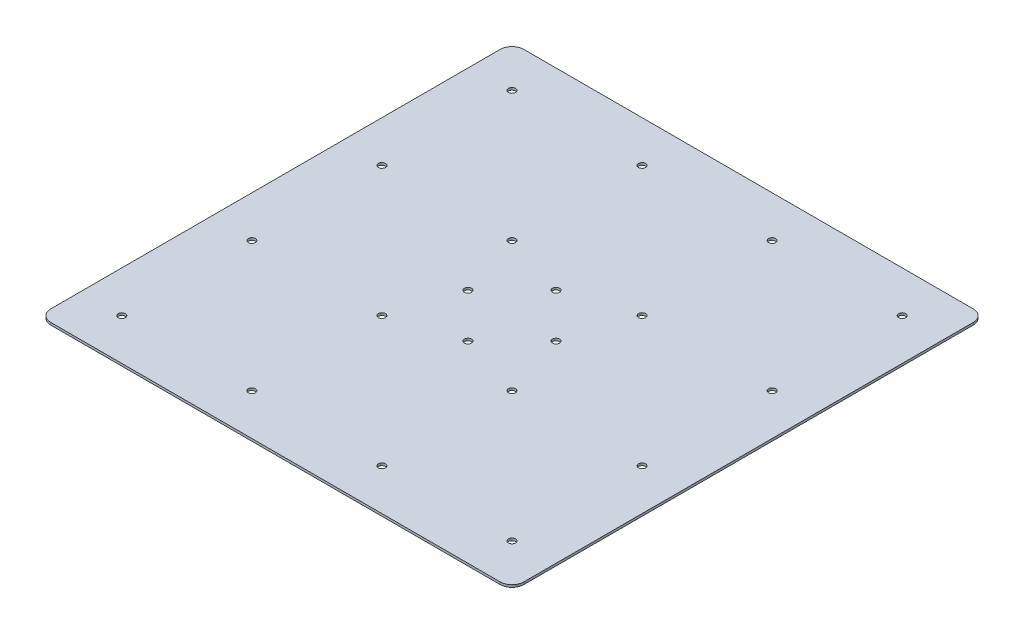
ISO-10303-21;
HEADER;
FILE_DESCRIPTION(('STEP AP214'),'2;1');
FILE_NAME('part.step','',(''),(''),'','','');
FILE_SCHEMA(('AUTOMOTIVE_DESIGN { 1 0 10303 214 1 1 1 1 }'));
ENDSEC;
DATA;
#1=APPLICATION_CONTEXT('core data for automotive mechanical design processes');
#2=APPLICATION_PROTOCOL_DEFINITION('international standard','automotive_design',2000,#1);
#3=PRODUCT_CONTEXT('',#1,'mechanical');
#4=PRODUCT('Part','Part','',(#3));
#5=PRODUCT_RELATED_PRODUCT_CATEGORY('part','',(#4));
#6=PRODUCT_DEFINITION_FORMATION('','',#4);
#7=PRODUCT_DEFINITION_CONTEXT('part definition',#1,'design');
#8=PRODUCT_DEFINITION('design','',#6,#7);
#9=PRODUCT_DEFINITION_SHAPE('','',#8);
#10=(LENGTH_UNIT() NAMED_UNIT(*) SI_UNIT(.MILLI.,.METRE.));
#11=(NAMED_UNIT(*) PLANE_ANGLE_UNIT() SI_UNIT($,.RADIAN.));
#12=(NAMED_UNIT(*) SI_UNIT($,.STERADIAN.) SOLID_ANGLE_UNIT());
#13=UNCERTAINTY_MEASURE_WITH_UNIT(LENGTH_MEASURE(1.E-05),#10,'distance_accuracy_value','');
#14=(GEOMETRIC_REPRESENTATION_CONTEXT(3) GLOBAL_UNCERTAINTY_ASSIGNED_CONTEXT((#13)) GLOBAL_UNIT_ASSIGNED_CONTEXT((#10,
#11,#12)) REPRESENTATION_CONTEXT('',''));
#15=CARTESIAN_POINT('',(0.,0.,0.));
#16=DIRECTION('',(0.,0.,1.));
#17=DIRECTION('',(1.,0.,0.));
#18=AXIS2_PLACEMENT_3D('',#15,#16,#17);
#19=CARTESIAN_POINT('',(200.,2.,-200.));
#20=DIRECTION('',(-1.,0.,0.));
#21=DIRECTION('',(0.,0.,1.));
#22=AXIS2_PLACEMENT_3D('',#19,#20,#21);
#23=PLANE('',#22);
#24=DIRECTION('',(0.,0.,-1.));
#25=VECTOR('',#24,1.);
#26=CARTESIAN_POINT('',(200.,2.,-200.));
#27=LINE('',#26,#25);
#28=CARTESIAN_POINT('',(200.,2.,190.));
#29=VERTEX_POINT('',#28);
#30=CARTESIAN_POINT('',(200.,2.,-190.));
#31=VERTEX_POINT('',#30);
#32=EDGE_CURVE('E128',#29,#31,#27,.T.);
#33=ORIENTED_EDGE('',*,*,#32,.F.);
#34=DIRECTION('',(0.,-1.,0.));
#35=VECTOR('',#34,1.);
#36=CARTESIAN_POINT('',(200.,2.,190.));
#37=LINE('',#36,#35);
#38=CARTESIAN_POINT('',(200.,0.,190.));
#39=VERTEX_POINT('',#38);
#40=EDGE_CURVE('E154',#29,#39,#37,.T.);
#41=ORIENTED_EDGE('',*,*,#40,.T.);
#42=DIRECTION('',(0.,0.,-1.));
#43=VECTOR('',#42,1.);
#44=CARTESIAN_POINT('',(200.,0.,-200.));
#45=LINE('',#44,#43);
#46=CARTESIAN_POINT('',(200.,0.,-190.));
#47=VERTEX_POINT('',#46);
#48=EDGE_CURVE('E160',#39,#47,#45,.T.);
#49=ORIENTED_EDGE('',*,*,#48,.T.);
#50=DIRECTION('',(0.,-1.,0.));
#51=VECTOR('',#50,1.);
#52=CARTESIAN_POINT('',(200.,2.,-190.));
#53=LINE('',#52,#51);
#54=EDGE_CURVE('E152',#47,#31,#53,.F.);
#55=ORIENTED_EDGE('',*,*,#54,.T.);
#56=EDGE_LOOP('',(#33,#41,#49,#55));
#57=FACE_BOUND('',#56,.T.);
#58=ADVANCED_FACE('F36',(#57),#23,.F.);
#59=CARTESIAN_POINT('',(-200.,2.,-200.));
#60=DIRECTION('',(0.,0.,1.));
#61=DIRECTION('',(1.,0.,0.));
#62=AXIS2_PLACEMENT_3D('',#59,#60,#61);
#63=PLANE('',#62);
#64=DIRECTION('',(-1.,0.,0.));
#65=VECTOR('',#64,1.);
#66=CARTESIAN_POINT('',(-200.,2.,-200.));
#67=LINE('',#66,#65);
#68=CARTESIAN_POINT('',(190.,2.,-200.));
#69=VERTEX_POINT('',#68);
#70=CARTESIAN_POINT('',(-190.,2.,-200.));
#71=VERTEX_POINT('',#70);
#72=EDGE_CURVE('E131',#69,#71,#67,.T.);
#73=ORIENTED_EDGE('',*,*,#72,.F.);
#74=DIRECTION('',(0.,-1.,0.));
#75=VECTOR('',#74,1.);
#76=CARTESIAN_POINT('',(190.,2.,-200.));
#77=LINE('',#76,#75);
#78=CARTESIAN_POINT('',(190.,0.,-200.));
#79=VERTEX_POINT('',#78);
#80=EDGE_CURVE('E11',#69,#79,#77,.T.);
#81=ORIENTED_EDGE('',*,*,#80,.T.);
#82=DIRECTION('',(-1.,0.,0.));
#83=VECTOR('',#82,1.);
#84=CARTESIAN_POINT('',(-200.,0.,-200.));
#85=LINE('',#84,#83);
#86=CARTESIAN_POINT('',(-190.,0.,-200.));
#87=VERTEX_POINT('',#86);
#88=EDGE_CURVE('E133',#79,#87,#85,.T.);
#89=ORIENTED_EDGE('',*,*,#88,.T.);
#90=DIRECTION('',(0.,-1.,0.));
#91=VECTOR('',#90,1.);
#92=CARTESIAN_POINT('',(-190.,2.,-200.));
#93=LINE('',#92,#91);
#94=EDGE_CURVE('E44',#87,#71,#93,.F.);
#95=ORIENTED_EDGE('',*,*,#94,.T.);
#96=EDGE_LOOP('',(#73,#81,#89,#95));
#97=FACE_BOUND('',#96,.T.);
#98=ADVANCED_FACE('F333',(#97),#63,.F.);
#99=CARTESIAN_POINT('',(-200.,2.,-200.));
#100=DIRECTION('',(1.,0.,0.));
#101=DIRECTION('',(0.,0.,-1.));
#102=AXIS2_PLACEMENT_3D('',#99,#100,#101);
#103=PLANE('',#102);
#104=DIRECTION('',(0.,0.,1.));
#105=VECTOR('',#104,1.);
#106=CARTESIAN_POINT('',(-200.,0.,-200.));
#107=LINE('',#106,#105);
#108=CARTESIAN_POINT('',(-200.,0.,-190.));
#109=VERTEX_POINT('',#108);
#110=CARTESIAN_POINT('',(-200.,0.,190.));
#111=VERTEX_POINT('',#110);
#112=EDGE_CURVE('E129',#109,#111,#107,.T.);
#113=ORIENTED_EDGE('',*,*,#112,.T.);
#114=DIRECTION('',(0.,-1.,0.));
#115=VECTOR('',#114,1.);
#116=CARTESIAN_POINT('',(-200.,2.,190.));
#117=LINE('',#116,#115);
#118=CARTESIAN_POINT('',(-200.,2.,190.));
#119=VERTEX_POINT('',#118);
#120=EDGE_CURVE('E107',#111,#119,#117,.F.);
#121=ORIENTED_EDGE('',*,*,#120,.T.);
#122=DIRECTION('',(0.,0.,1.));
#123=VECTOR('',#122,1.);
#124=CARTESIAN_POINT('',(-200.,2.,-200.));
#125=LINE('',#124,#123);
#126=CARTESIAN_POINT('',(-200.,2.,-190.));
#127=VERTEX_POINT('',#126);
#128=EDGE_CURVE('E172',#127,#119,#125,.T.);
#129=ORIENTED_EDGE('',*,*,#128,.F.);
#130=DIRECTION('',(0.,-1.,0.));
#131=VECTOR('',#130,1.);
#132=CARTESIAN_POINT('',(-200.,2.,-190.));
#133=LINE('',#132,#131);
#134=EDGE_CURVE('E112',#127,#109,#133,.T.);
#135=ORIENTED_EDGE('',*,*,#134,.T.);
#136=EDGE_LOOP('',(#113,#121,#129,#135));
#137=FACE_BOUND('',#136,.T.);
#138=ADVANCED_FACE('F331',(#137),#103,.F.);
#139=CARTESIAN_POINT('',(-200.,2.,200.));
#140=DIRECTION('',(0.,0.,-1.));
#141=DIRECTION('',(-1.,0.,0.));
#142=AXIS2_PLACEMENT_3D('',#139,#140,#141);
#143=PLANE('',#142);
#144=DIRECTION('',(1.,0.,0.));
#145=VECTOR('',#144,1.);
#146=CARTESIAN_POINT('',(-200.,2.,200.));
#147=LINE('',#146,#145);
#148=CARTESIAN_POINT('',(-190.,2.,200.));
#149=VERTEX_POINT('',#148);
#150=CARTESIAN_POINT('',(190.,2.,200.));
#151=VERTEX_POINT('',#150);
#152=EDGE_CURVE('E122',#149,#151,#147,.T.);
#153=ORIENTED_EDGE('',*,*,#152,.F.);
#154=DIRECTION('',(0.,-1.,0.));
#155=VECTOR('',#154,1.);
#156=CARTESIAN_POINT('',(-190.,2.,200.));
#157=LINE('',#156,#155);
#158=CARTESIAN_POINT('',(-190.,0.,200.));
#159=VERTEX_POINT('',#158);
#160=EDGE_CURVE('E106',#149,#159,#157,.T.);
#161=ORIENTED_EDGE('',*,*,#160,.T.);
#162=DIRECTION('',(1.,0.,0.));
#163=VECTOR('',#162,1.);
#164=CARTESIAN_POINT('',(-200.,0.,200.));
#165=LINE('',#164,#163);
#166=CARTESIAN_POINT('',(190.,0.,200.));
#167=VERTEX_POINT('',#166);
#168=EDGE_CURVE('E119',#159,#167,#165,.T.);
#169=ORIENTED_EDGE('',*,*,#168,.T.);
#170=DIRECTION('',(0.,-1.,0.));
#171=VECTOR('',#170,1.);
#172=CARTESIAN_POINT('',(190.,2.,200.));
#173=LINE('',#172,#171);
#174=EDGE_CURVE('E124',#167,#151,#173,.F.);
#175=ORIENTED_EDGE('',*,*,#174,.T.);
#176=EDGE_LOOP('',(#153,#161,#169,#175));
#177=FACE_BOUND('',#176,.T.);
#178=ADVANCED_FACE('F118',(#177),#143,.F.);
#179=CARTESIAN_POINT('',(0.,2.,0.));
#180=DIRECTION('',(0.,1.,0.));
#181=DIRECTION('',(0.,0.,1.));
#182=AXIS2_PLACEMENT_3D('',#179,#180,#181);
#183=PLANE('',#182);
#184=CARTESIAN_POINT('',(55.0000000000022,2.,55.));
#185=DIRECTION('',(0.,1.,0.));
#186=DIRECTION('',(0.,0.,1.));
#187=AXIS2_PLACEMENT_3D('',#184,#185,#186);
#188=CIRCLE('',#187,2.99999999999999);
#189=CARTESIAN_POINT('',(55.0000000000022,2.,58.));
#190=VERTEX_POINT('',#189);
#191=EDGE_CURVE('E227',#190,#190,#188,.T.);
#192=ORIENTED_EDGE('',*,*,#191,.F.);
#193=EDGE_LOOP('',(#192));
#194=FACE_BOUND('',#193,.T.);
#195=CARTESIAN_POINT('',(-54.9999999999978,2.,55.));
#196=DIRECTION('',(0.,1.,0.));
#197=DIRECTION('',(0.,0.,1.));
#198=AXIS2_PLACEMENT_3D('',#195,#196,#197);
#199=CIRCLE('',#198,2.99999999999999);
#200=CARTESIAN_POINT('',(-54.9999999999978,2.,58.));
#201=VERTEX_POINT('',#200);
#202=EDGE_CURVE('E234',#201,#201,#199,.T.);
#203=ORIENTED_EDGE('',*,*,#202,.F.);
#204=EDGE_LOOP('',(#203));
#205=FACE_BOUND('',#204,.T.);
#206=CARTESIAN_POINT('',(165.000000000001,2.,-55.));
#207=DIRECTION('',(0.,1.,0.));
#208=DIRECTION('',(0.,0.,1.));
#209=AXIS2_PLACEMENT_3D('',#206,#207,#208);
#210=CIRCLE('',#209,2.99999999999999);
#211=CARTESIAN_POINT('',(165.000000000001,2.,-52.));
#212=VERTEX_POINT('',#211);
#213=EDGE_CURVE('E240',#212,#212,#210,.T.);
#214=ORIENTED_EDGE('',*,*,#213,.F.);
#215=EDGE_LOOP('',(#214));
#216=FACE_BOUND('',#215,.T.);
#217=CARTESIAN_POINT('',(55.0000000000011,2.,-55.));
#218=DIRECTION('',(0.,1.,0.));
#219=DIRECTION('',(0.,0.,1.));
#220=AXIS2_PLACEMENT_3D('',#217,#218,#219);
#221=CIRCLE('',#220,2.99999999999999);
#222=CARTESIAN_POINT('',(55.0000000000011,2.,-52.));
#223=VERTEX_POINT('',#222);
#224=EDGE_CURVE('E246',#223,#223,#221,.T.);
#225=ORIENTED_EDGE('',*,*,#224,.F.);
#226=EDGE_LOOP('',(#225));
#227=FACE_BOUND('',#226,.T.);
#228=CARTESIAN_POINT('',(-55.0000000000001,2.,-165.));
#229=DIRECTION('',(0.,1.,0.));
#230=DIRECTION('',(0.,0.,1.));
#231=AXIS2_PLACEMENT_3D('',#228,#229,#230);
#232=CIRCLE('',#231,2.99999999999999);
#233=CARTESIAN_POINT('',(-55.0000000000001,2.,-162.));
#234=VERTEX_POINT('',#233);
#235=EDGE_CURVE('E210',#234,#234,#232,.T.);
#236=ORIENTED_EDGE('',*,*,#235,.F.);
#237=EDGE_LOOP('',(#236));
#238=FACE_BOUND('',#237,.T.);
#239=CARTESIAN_POINT('',(54.9999999999999,2.,-165.));
#240=DIRECTION('',(0.,1.,0.));
#241=DIRECTION('',(0.,0.,1.));
#242=AXIS2_PLACEMENT_3D('',#239,#240,#241);
#243=CIRCLE('',#242,2.99999999999999);
#244=CARTESIAN_POINT('',(54.9999999999999,2.,-162.));
#245=VERTEX_POINT('',#244);
#246=EDGE_CURVE('E203',#245,#245,#243,.T.);
#247=ORIENTED_EDGE('',*,*,#246,.F.);
#248=EDGE_LOOP('',(#247));
#249=FACE_BOUND('',#248,.T.);
#250=CARTESIAN_POINT('',(165.,2.,-165.));
#251=DIRECTION('',(0.,1.,0.));
#252=DIRECTION('',(0.,0.,1.));
#253=AXIS2_PLACEMENT_3D('',#250,#251,#252);
#254=CIRCLE('',#253,2.99999999999999);
#255=CARTESIAN_POINT('',(165.,2.,-162.));
#256=VERTEX_POINT('',#255);
#257=EDGE_CURVE('E222',#256,#256,#254,.T.);
#258=ORIENTED_EDGE('',*,*,#257,.F.);
#259=EDGE_LOOP('',(#258));
#260=FACE_BOUND('',#259,.T.);
#261=CARTESIAN_POINT('',(-54.999999999999,2.,-55.));
#262=DIRECTION('',(0.,1.,0.));
#263=DIRECTION('',(0.,0.,1.));
#264=AXIS2_PLACEMENT_3D('',#261,#262,#263);
#265=CIRCLE('',#264,2.99999999999999);
#266=CARTESIAN_POINT('',(-54.999999999999,2.,-52.));
#267=VERTEX_POINT('',#266);
#268=EDGE_CURVE('E215',#267,#267,#265,.T.);
#269=ORIENTED_EDGE('',*,*,#268,.F.);
#270=EDGE_LOOP('',(#269));
#271=FACE_BOUND('',#270,.T.);
#272=CARTESIAN_POINT('',(165.000000000003,2.,165.));
#273=DIRECTION('',(0.,1.,0.));
#274=DIRECTION('',(0.,0.,1.));
#275=AXIS2_PLACEMENT_3D('',#272,#273,#274);
#276=CIRCLE('',#275,2.99999999999999);
#277=CARTESIAN_POINT('',(165.000000000003,2.,168.));
#278=VERTEX_POINT('',#277);
#279=EDGE_CURVE('E269',#278,#278,#276,.T.);
#280=ORIENTED_EDGE('',*,*,#279,.F.);
#281=EDGE_LOOP('',(#280));
#282=FACE_BOUND('',#281,.T.);
#283=CARTESIAN_POINT('',(55.0000000000034,2.,165.));
#284=DIRECTION('',(0.,1.,0.));
#285=DIRECTION('',(0.,0.,1.));
#286=AXIS2_PLACEMENT_3D('',#283,#284,#285);
#287=CIRCLE('',#286,2.99999999999999);
#288=CARTESIAN_POINT('',(55.0000000000034,2.,168.));
#289=VERTEX_POINT('',#288);
#290=EDGE_CURVE('E287',#289,#289,#287,.T.);
#291=ORIENTED_EDGE('',*,*,#290,.F.);
#292=EDGE_LOOP('',(#291));
#293=FACE_BOUND('',#292,.T.);
#294=CARTESIAN_POINT('',(-54.9999999999967,2.,165.));
#295=DIRECTION('',(0.,1.,0.));
#296=DIRECTION('',(0.,0.,1.));
#297=AXIS2_PLACEMENT_3D('',#294,#295,#296);
#298=CIRCLE('',#297,2.99999999999999);
#299=CARTESIAN_POINT('',(-54.9999999999967,2.,168.));
#300=VERTEX_POINT('',#299);
#301=EDGE_CURVE('E270',#300,#300,#298,.T.);
#302=ORIENTED_EDGE('',*,*,#301,.F.);
#303=EDGE_LOOP('',(#302));
#304=FACE_BOUND('',#303,.T.);
#305=CARTESIAN_POINT('',(165.000000000002,2.,55.));
#306=DIRECTION('',(0.,1.,0.));
#307=DIRECTION('',(0.,0.,1.));
#308=AXIS2_PLACEMENT_3D('',#305,#306,#307);
#309=CIRCLE('',#308,2.99999999999999);
#310=CARTESIAN_POINT('',(165.000000000002,2.,58.));
#311=VERTEX_POINT('',#310);
#312=EDGE_CURVE('E277',#311,#311,#309,.T.);
#313=ORIENTED_EDGE('',*,*,#312,.F.);
#314=EDGE_LOOP('',(#313));
#315=FACE_BOUND('',#314,.T.);
#316=CARTESIAN_POINT('',(-164.999999999999,2.,-55.));
#317=DIRECTION('',(0.,1.,0.));
#318=DIRECTION('',(0.,0.,1.));
#319=AXIS2_PLACEMENT_3D('',#316,#317,#318);
#320=CIRCLE('',#319,2.99999999999999);
#321=CARTESIAN_POINT('',(-164.999999999999,2.,-52.));
#322=VERTEX_POINT('',#321);
#323=EDGE_CURVE('E263',#322,#322,#320,.T.);
#324=ORIENTED_EDGE('',*,*,#323,.F.);
#325=EDGE_LOOP('',(#324));
#326=FACE_BOUND('',#325,.T.);
#327=CARTESIAN_POINT('',(-164.999999999998,2.,55.));
#328=DIRECTION('',(0.,1.,0.));
#329=DIRECTION('',(0.,0.,1.));
#330=AXIS2_PLACEMENT_3D('',#327,#328,#329);
#331=CIRCLE('',#330,2.99999999999999);
#332=CARTESIAN_POINT('',(-164.999999999998,2.,58.));
#333=VERTEX_POINT('',#332);
#334=EDGE_CURVE('E257',#333,#333,#331,.T.);
#335=ORIENTED_EDGE('',*,*,#334,.F.);
#336=EDGE_LOOP('',(#335));
#337=FACE_BOUND('',#336,.T.);
#338=CARTESIAN_POINT('',(-164.999999999997,2.,165.));
#339=DIRECTION('',(0.,1.,0.));
#340=DIRECTION('',(0.,0.,1.));
#341=AXIS2_PLACEMENT_3D('',#338,#339,#340);
#342=CIRCLE('',#341,2.99999999999999);
#343=CARTESIAN_POINT('',(-164.999999999997,2.,168.));
#344=VERTEX_POINT('',#343);
#345=EDGE_CURVE('E251',#344,#344,#342,.T.);
#346=ORIENTED_EDGE('',*,*,#345,.F.);
#347=EDGE_LOOP('',(#346));
#348=FACE_BOUND('',#347,.T.);
#349=CARTESIAN_POINT('',(-165.,2.,-165.));
#350=DIRECTION('',(0.,1.,0.));
#351=DIRECTION('',(0.,0.,1.));
#352=AXIS2_PLACEMENT_3D('',#349,#350,#351);
#353=CIRCLE('',#352,2.99999999999999);
#354=CARTESIAN_POINT('',(-165.,2.,-162.));
#355=VERTEX_POINT('',#354);
#356=EDGE_CURVE('E197',#355,#355,#353,.T.);
#357=ORIENTED_EDGE('',*,*,#356,.F.);
#358=EDGE_LOOP('',(#357));
#359=FACE_BOUND('',#358,.T.);
#360=CARTESIAN_POINT('',(-3.87705226760231E-13,2.,37.25));
#361=DIRECTION('',(0.,1.,0.));
#362=DIRECTION('',(0.,0.,1.));
#363=AXIS2_PLACEMENT_3D('',#360,#361,#362);
#364=CIRCLE('',#363,3.);
#365=CARTESIAN_POINT('',(-3.87705226760231E-13,2.,40.25));
#366=VERTEX_POINT('',#365);
#367=EDGE_CURVE('E168',#366,#366,#364,.T.);
#368=ORIENTED_EDGE('',*,*,#367,.F.);
#369=EDGE_LOOP('',(#368));
#370=FACE_BOUND('',#369,.T.);
#371=CARTESIAN_POINT('',(-37.25,2.,0.));
#372=DIRECTION('',(0.,1.,0.));
#373=DIRECTION('',(0.,0.,1.));
#374=AXIS2_PLACEMENT_3D('',#371,#372,#373);
#375=CIRCLE('',#374,3.);
#376=CARTESIAN_POINT('',(-37.25,2.,3.));
#377=VERTEX_POINT('',#376);
#378=EDGE_CURVE('E192',#377,#377,#375,.T.);
#379=ORIENTED_EDGE('',*,*,#378,.F.);
#380=EDGE_LOOP('',(#379));
#381=FACE_BOUND('',#380,.T.);
#382=CARTESIAN_POINT('',(1.20650973112511E-13,2.,-37.25));
#383=DIRECTION('',(0.,1.,0.));
#384=DIRECTION('',(0.,0.,1.));
#385=AXIS2_PLACEMENT_3D('',#382,#383,#384);
#386=CIRCLE('',#385,3.);
#387=CARTESIAN_POINT('',(1.20650973112511E-13,2.,-34.25));
#388=VERTEX_POINT('',#387);
#389=EDGE_CURVE('E186',#388,#388,#386,.T.);
#390=ORIENTED_EDGE('',*,*,#389,.F.);
#391=EDGE_LOOP('',(#390));
#392=FACE_BOUND('',#391,.T.);
#393=CARTESIAN_POINT('',(37.25,2.,2.57647546888325E-13));
#394=DIRECTION('',(0.,1.,0.));
#395=DIRECTION('',(0.,0.,1.));
#396=AXIS2_PLACEMENT_3D('',#393,#394,#395);
#397=CIRCLE('',#396,3.);
#398=CARTESIAN_POINT('',(37.25,2.,3.00000000000026));
#399=VERTEX_POINT('',#398);
#400=EDGE_CURVE('E179',#399,#399,#397,.T.);
#401=ORIENTED_EDGE('',*,*,#400,.F.);
#402=EDGE_LOOP('',(#401));
#403=FACE_BOUND('',#402,.T.);
#404=ORIENTED_EDGE('',*,*,#128,.T.);
#405=CARTESIAN_POINT('',(-190.,2.,190.));
#406=DIRECTION('',(0.,1.,0.));
#407=DIRECTION('',(0.,0.,1.));
#408=AXIS2_PLACEMENT_3D('',#405,#406,#407);
#409=CIRCLE('',#408,10.);
#410=EDGE_CURVE('E150',#119,#149,#409,.T.);
#411=ORIENTED_EDGE('',*,*,#410,.T.);
#412=ORIENTED_EDGE('',*,*,#152,.T.);
#413=CARTESIAN_POINT('',(190.,2.,190.));
#414=DIRECTION('',(0.,1.,0.));
#415=DIRECTION('',(0.,0.,1.));
#416=AXIS2_PLACEMENT_3D('',#413,#414,#415);
#417=CIRCLE('',#416,10.);
#418=EDGE_CURVE('E148',#151,#29,#417,.T.);
#419=ORIENTED_EDGE('',*,*,#418,.T.);
#420=ORIENTED_EDGE('',*,*,#32,.T.);
#421=CARTESIAN_POINT('',(190.,2.,-190.));
#422=DIRECTION('',(0.,1.,0.));
#423=DIRECTION('',(0.,0.,1.));
#424=AXIS2_PLACEMENT_3D('',#421,#422,#423);
#425=CIRCLE('',#424,10.);
#426=EDGE_CURVE('E57',#31,#69,#425,.T.);
#427=ORIENTED_EDGE('',*,*,#426,.T.);
#428=ORIENTED_EDGE('',*,*,#72,.T.);
#429=CARTESIAN_POINT('',(-190.,2.,-190.));
#430=DIRECTION('',(0.,1.,0.));
#431=DIRECTION('',(0.,0.,1.));
#432=AXIS2_PLACEMENT_3D('',#429,#430,#431);
#433=CIRCLE('',#432,10.);
#434=EDGE_CURVE('E145',#71,#127,#433,.T.);
#435=ORIENTED_EDGE('',*,*,#434,.T.);
#436=EDGE_LOOP('',(#404,#411,#412,#419,#420,#427,#428,#435));
#437=FACE_BOUND('',#436,.T.);
#438=ADVANCED_FACE('F303',(#194,#205,#216,#227,#238,#249,#260,#271,#282,#293,#304,#315,#326,
#337,#348,#359,#370,#381,#392,#403,#437),#183,.T.);
#439=CARTESIAN_POINT('',(0.,0.,0.));
#440=DIRECTION('',(0.,1.,0.));
#441=DIRECTION('',(0.,0.,1.));
#442=AXIS2_PLACEMENT_3D('',#439,#440,#441);
#443=PLANE('',#442);
#444=CARTESIAN_POINT('',(55.0000000000022,0.,55.));
#445=DIRECTION('',(0.,1.,0.));
#446=DIRECTION('',(0.,0.,1.));
#447=AXIS2_PLACEMENT_3D('',#444,#445,#446);
#448=CIRCLE('',#447,2.99999999999999);
#449=CARTESIAN_POINT('',(55.0000000000022,0.,58.));
#450=VERTEX_POINT('',#449);
#451=EDGE_CURVE('E230',#450,#450,#448,.T.);
#452=ORIENTED_EDGE('',*,*,#451,.T.);
#453=EDGE_LOOP('',(#452));
#454=FACE_BOUND('',#453,.T.);
#455=CARTESIAN_POINT('',(-54.9999999999978,0.,55.));
#456=DIRECTION('',(0.,1.,0.));
#457=DIRECTION('',(0.,0.,1.));
#458=AXIS2_PLACEMENT_3D('',#455,#456,#457);
#459=CIRCLE('',#458,2.99999999999999);
#460=CARTESIAN_POINT('',(-54.9999999999978,0.,58.));
#461=VERTEX_POINT('',#460);
#462=EDGE_CURVE('E237',#461,#461,#459,.T.);
#463=ORIENTED_EDGE('',*,*,#462,.T.);
#464=EDGE_LOOP('',(#463));
#465=FACE_BOUND('',#464,.T.);
#466=CARTESIAN_POINT('',(165.000000000001,0.,-55.));
#467=DIRECTION('',(0.,1.,0.));
#468=DIRECTION('',(0.,0.,1.));
#469=AXIS2_PLACEMENT_3D('',#466,#467,#468);
#470=CIRCLE('',#469,2.99999999999999);
#471=CARTESIAN_POINT('',(165.000000000001,0.,-52.));
#472=VERTEX_POINT('',#471);
#473=EDGE_CURVE('E243',#472,#472,#470,.T.);
#474=ORIENTED_EDGE('',*,*,#473,.T.);
#475=EDGE_LOOP('',(#474));
#476=FACE_BOUND('',#475,.T.);
#477=CARTESIAN_POINT('',(55.0000000000011,0.,-55.));
#478=DIRECTION('',(0.,1.,0.));
#479=DIRECTION('',(0.,0.,1.));
#480=AXIS2_PLACEMENT_3D('',#477,#478,#479);
#481=CIRCLE('',#480,2.99999999999999);
#482=CARTESIAN_POINT('',(55.0000000000011,0.,-52.));
#483=VERTEX_POINT('',#482);
#484=EDGE_CURVE('E219',#483,#483,#481,.T.);
#485=ORIENTED_EDGE('',*,*,#484,.T.);
#486=EDGE_LOOP('',(#485));
#487=FACE_BOUND('',#486,.T.);
#488=CARTESIAN_POINT('',(-55.0000000000001,0.,-165.));
#489=DIRECTION('',(0.,1.,0.));
#490=DIRECTION('',(0.,0.,1.));
#491=AXIS2_PLACEMENT_3D('',#488,#489,#490);
#492=CIRCLE('',#491,2.99999999999999);
#493=CARTESIAN_POINT('',(-55.0000000000001,0.,-162.));
#494=VERTEX_POINT('',#493);
#495=EDGE_CURVE('E200',#494,#494,#492,.T.);
#496=ORIENTED_EDGE('',*,*,#495,.T.);
#497=EDGE_LOOP('',(#496));
#498=FACE_BOUND('',#497,.T.);
#499=CARTESIAN_POINT('',(54.9999999999999,0.,-165.));
#500=DIRECTION('',(0.,1.,0.));
#501=DIRECTION('',(0.,0.,1.));
#502=AXIS2_PLACEMENT_3D('',#499,#500,#501);
#503=CIRCLE('',#502,2.99999999999999);
#504=CARTESIAN_POINT('',(54.9999999999999,0.,-162.));
#505=VERTEX_POINT('',#504);
#506=EDGE_CURVE('E206',#505,#505,#503,.T.);
#507=ORIENTED_EDGE('',*,*,#506,.T.);
#508=EDGE_LOOP('',(#507));
#509=FACE_BOUND('',#508,.T.);
#510=CARTESIAN_POINT('',(165.,0.,-165.));
#511=DIRECTION('',(0.,1.,0.));
#512=DIRECTION('',(0.,0.,1.));
#513=AXIS2_PLACEMENT_3D('',#510,#511,#512);
#514=CIRCLE('',#513,2.99999999999999);
#515=CARTESIAN_POINT('',(165.,0.,-162.));
#516=VERTEX_POINT('',#515);
#517=EDGE_CURVE('E207',#516,#516,#514,.T.);
#518=ORIENTED_EDGE('',*,*,#517,.T.);
#519=EDGE_LOOP('',(#518));
#520=FACE_BOUND('',#519,.T.);
#521=CARTESIAN_POINT('',(-54.999999999999,0.,-55.));
#522=DIRECTION('',(0.,1.,0.));
#523=DIRECTION('',(0.,0.,1.));
#524=AXIS2_PLACEMENT_3D('',#521,#522,#523);
#525=CIRCLE('',#524,2.99999999999999);
#526=CARTESIAN_POINT('',(-54.999999999999,0.,-52.));
#527=VERTEX_POINT('',#526);
#528=EDGE_CURVE('E218',#527,#527,#525,.T.);
#529=ORIENTED_EDGE('',*,*,#528,.T.);
#530=EDGE_LOOP('',(#529));
#531=FACE_BOUND('',#530,.T.);
#532=CARTESIAN_POINT('',(165.000000000003,0.,165.));
#533=DIRECTION('',(0.,1.,0.));
#534=DIRECTION('',(0.,0.,1.));
#535=AXIS2_PLACEMENT_3D('',#532,#533,#534);
#536=CIRCLE('',#535,2.99999999999999);
#537=CARTESIAN_POINT('',(165.000000000003,0.,168.));
#538=VERTEX_POINT('',#537);
#539=EDGE_CURVE('E284',#538,#538,#536,.T.);
#540=ORIENTED_EDGE('',*,*,#539,.T.);
#541=EDGE_LOOP('',(#540));
#542=FACE_BOUND('',#541,.T.);
#543=CARTESIAN_POINT('',(55.0000000000034,0.,165.));
#544=DIRECTION('',(0.,1.,0.));
#545=DIRECTION('',(0.,0.,1.));
#546=AXIS2_PLACEMENT_3D('',#543,#544,#545);
#547=CIRCLE('',#546,2.99999999999999);
#548=CARTESIAN_POINT('',(55.0000000000034,0.,168.));
#549=VERTEX_POINT('',#548);
#550=EDGE_CURVE('E274',#549,#549,#547,.T.);
#551=ORIENTED_EDGE('',*,*,#550,.T.);
#552=EDGE_LOOP('',(#551));
#553=FACE_BOUND('',#552,.T.);
#554=CARTESIAN_POINT('',(-54.9999999999967,0.,165.));
#555=DIRECTION('',(0.,1.,0.));
#556=DIRECTION('',(0.,0.,1.));
#557=AXIS2_PLACEMENT_3D('',#554,#555,#556);
#558=CIRCLE('',#557,2.99999999999999);
#559=CARTESIAN_POINT('',(-54.9999999999967,0.,168.));
#560=VERTEX_POINT('',#559);
#561=EDGE_CURVE('E273',#560,#560,#558,.T.);
#562=ORIENTED_EDGE('',*,*,#561,.T.);
#563=EDGE_LOOP('',(#562));
#564=FACE_BOUND('',#563,.T.);
#565=CARTESIAN_POINT('',(165.000000000002,0.,55.));
#566=DIRECTION('',(0.,1.,0.));
#567=DIRECTION('',(0.,0.,1.));
#568=AXIS2_PLACEMENT_3D('',#565,#566,#567);
#569=CIRCLE('',#568,2.99999999999999);
#570=CARTESIAN_POINT('',(165.000000000002,0.,58.));
#571=VERTEX_POINT('',#570);
#572=EDGE_CURVE('E231',#571,#571,#569,.T.);
#573=ORIENTED_EDGE('',*,*,#572,.T.);
#574=EDGE_LOOP('',(#573));
#575=FACE_BOUND('',#574,.T.);
#576=CARTESIAN_POINT('',(-164.999999999999,0.,-55.));
#577=DIRECTION('',(0.,1.,0.));
#578=DIRECTION('',(0.,0.,1.));
#579=AXIS2_PLACEMENT_3D('',#576,#577,#578);
#580=CIRCLE('',#579,2.99999999999999);
#581=CARTESIAN_POINT('',(-164.999999999999,0.,-52.));
#582=VERTEX_POINT('',#581);
#583=EDGE_CURVE('E266',#582,#582,#580,.T.);
#584=ORIENTED_EDGE('',*,*,#583,.T.);
#585=EDGE_LOOP('',(#584));
#586=FACE_BOUND('',#585,.T.);
#587=CARTESIAN_POINT('',(-164.999999999998,0.,55.));
#588=DIRECTION('',(0.,1.,0.));
#589=DIRECTION('',(0.,0.,1.));
#590=AXIS2_PLACEMENT_3D('',#587,#588,#589);
#591=CIRCLE('',#590,2.99999999999999);
#592=CARTESIAN_POINT('',(-164.999999999998,0.,58.));
#593=VERTEX_POINT('',#592);
#594=EDGE_CURVE('E260',#593,#593,#591,.T.);
#595=ORIENTED_EDGE('',*,*,#594,.T.);
#596=EDGE_LOOP('',(#595));
#597=FACE_BOUND('',#596,.T.);
#598=CARTESIAN_POINT('',(-164.999999999997,0.,165.));
#599=DIRECTION('',(0.,1.,0.));
#600=DIRECTION('',(0.,0.,1.));
#601=AXIS2_PLACEMENT_3D('',#598,#599,#600);
#602=CIRCLE('',#601,2.99999999999999);
#603=CARTESIAN_POINT('',(-164.999999999997,0.,168.));
#604=VERTEX_POINT('',#603);
#605=EDGE_CURVE('E254',#604,#604,#602,.T.);
#606=ORIENTED_EDGE('',*,*,#605,.T.);
#607=EDGE_LOOP('',(#606));
#608=FACE_BOUND('',#607,.T.);
#609=CARTESIAN_POINT('',(-165.,0.,-165.));
#610=DIRECTION('',(0.,1.,0.));
#611=DIRECTION('',(0.,0.,1.));
#612=AXIS2_PLACEMENT_3D('',#609,#610,#611);
#613=CIRCLE('',#612,2.99999999999999);
#614=CARTESIAN_POINT('',(-165.,0.,-162.));
#615=VERTEX_POINT('',#614);
#616=EDGE_CURVE('E180',#615,#615,#613,.T.);
#617=ORIENTED_EDGE('',*,*,#616,.T.);
#618=EDGE_LOOP('',(#617));
#619=FACE_BOUND('',#618,.T.);
#620=CARTESIAN_POINT('',(-3.87705226760231E-13,0.,37.25));
#621=DIRECTION('',(0.,1.,0.));
#622=DIRECTION('',(0.,0.,1.));
#623=AXIS2_PLACEMENT_3D('',#620,#621,#622);
#624=CIRCLE('',#623,3.);
#625=CARTESIAN_POINT('',(-3.87705226760231E-13,0.,40.25));
#626=VERTEX_POINT('',#625);
#627=EDGE_CURVE('E165',#626,#626,#624,.T.);
#628=ORIENTED_EDGE('',*,*,#627,.T.);
#629=EDGE_LOOP('',(#628));
#630=FACE_BOUND('',#629,.T.);
#631=CARTESIAN_POINT('',(-37.25,0.,0.));
#632=DIRECTION('',(0.,1.,0.));
#633=DIRECTION('',(0.,0.,1.));
#634=AXIS2_PLACEMENT_3D('',#631,#632,#633);
#635=CIRCLE('',#634,3.);
#636=CARTESIAN_POINT('',(-37.25,0.,3.));
#637=VERTEX_POINT('',#636);
#638=EDGE_CURVE('E189',#637,#637,#635,.T.);
#639=ORIENTED_EDGE('',*,*,#638,.T.);
#640=EDGE_LOOP('',(#639));
#641=FACE_BOUND('',#640,.T.);
#642=CARTESIAN_POINT('',(1.20650973112511E-13,0.,-37.25));
#643=DIRECTION('',(0.,1.,0.));
#644=DIRECTION('',(0.,0.,1.));
#645=AXIS2_PLACEMENT_3D('',#642,#643,#644);
#646=CIRCLE('',#645,3.);
#647=CARTESIAN_POINT('',(1.20650973112511E-13,0.,-34.25));
#648=VERTEX_POINT('',#647);
#649=EDGE_CURVE('E183',#648,#648,#646,.T.);
#650=ORIENTED_EDGE('',*,*,#649,.T.);
#651=EDGE_LOOP('',(#650));
#652=FACE_BOUND('',#651,.T.);
#653=CARTESIAN_POINT('',(37.25,0.,2.57647546888325E-13));
#654=DIRECTION('',(0.,1.,0.));
#655=DIRECTION('',(0.,0.,1.));
#656=AXIS2_PLACEMENT_3D('',#653,#654,#655);
#657=CIRCLE('',#656,3.);
#658=CARTESIAN_POINT('',(37.25,0.,3.00000000000026));
#659=VERTEX_POINT('',#658);
#660=EDGE_CURVE('E176',#659,#659,#657,.T.);
#661=ORIENTED_EDGE('',*,*,#660,.T.);
#662=EDGE_LOOP('',(#661));
#663=FACE_BOUND('',#662,.T.);
#664=ORIENTED_EDGE('',*,*,#168,.F.);
#665=CARTESIAN_POINT('',(-190.,0.,190.));
#666=DIRECTION('',(0.,1.,0.));
#667=DIRECTION('',(0.,0.,1.));
#668=AXIS2_PLACEMENT_3D('',#665,#666,#667);
#669=CIRCLE('',#668,10.);
#670=EDGE_CURVE('E102',#159,#111,#669,.F.);
#671=ORIENTED_EDGE('',*,*,#670,.T.);
#672=ORIENTED_EDGE('',*,*,#112,.F.);
#673=CARTESIAN_POINT('',(-190.,0.,-190.));
#674=DIRECTION('',(0.,1.,0.));
#675=DIRECTION('',(0.,0.,1.));
#676=AXIS2_PLACEMENT_3D('',#673,#674,#675);
#677=CIRCLE('',#676,10.);
#678=EDGE_CURVE('E123',#109,#87,#677,.F.);
#679=ORIENTED_EDGE('',*,*,#678,.T.);
#680=ORIENTED_EDGE('',*,*,#88,.F.);
#681=CARTESIAN_POINT('',(190.,0.,-190.));
#682=DIRECTION('',(0.,1.,0.));
#683=DIRECTION('',(0.,0.,1.));
#684=AXIS2_PLACEMENT_3D('',#681,#682,#683);
#685=CIRCLE('',#684,10.);
#686=EDGE_CURVE('E139',#79,#47,#685,.F.);
#687=ORIENTED_EDGE('',*,*,#686,.T.);
#688=ORIENTED_EDGE('',*,*,#48,.F.);
#689=CARTESIAN_POINT('',(190.,0.,190.));
#690=DIRECTION('',(0.,1.,0.));
#691=DIRECTION('',(0.,0.,1.));
#692=AXIS2_PLACEMENT_3D('',#689,#690,#691);
#693=CIRCLE('',#692,10.);
#694=EDGE_CURVE('E113',#39,#167,#693,.F.);
#695=ORIENTED_EDGE('',*,*,#694,.T.);
#696=EDGE_LOOP('',(#664,#671,#672,#679,#680,#687,#688,#695));
#697=FACE_BOUND('',#696,.T.);
#698=ADVANCED_FACE('F126',(#454,#465,#476,#487,#498,#509,#520,#531,#542,#553,#564,#575,#586,
#597,#608,#619,#630,#641,#652,#663,#697),#443,.F.);
#699=CARTESIAN_POINT('',(37.25,0.,2.57647546888325E-13));
#700=DIRECTION('',(0.,1.,0.));
#701=DIRECTION('',(0.,0.,1.));
#702=AXIS2_PLACEMENT_3D('',#699,#700,#701);
#703=CYLINDRICAL_SURFACE('',#702,3.);
#704=ORIENTED_EDGE('',*,*,#660,.F.);
#705=EDGE_LOOP('',(#704));
#706=FACE_BOUND('',#705,.T.);
#707=ORIENTED_EDGE('',*,*,#400,.T.);
#708=EDGE_LOOP('',(#707));
#709=FACE_BOUND('',#708,.T.);
#710=ADVANCED_FACE('F358',(#706,#709),#703,.F.);
#711=CARTESIAN_POINT('',(1.20650973112511E-13,0.,-37.25));
#712=DIRECTION('',(0.,1.,0.));
#713=DIRECTION('',(0.,0.,1.));
#714=AXIS2_PLACEMENT_3D('',#711,#712,#713);
#715=CYLINDRICAL_SURFACE('',#714,3.);
#716=ORIENTED_EDGE('',*,*,#649,.F.);
#717=EDGE_LOOP('',(#716));
#718=FACE_BOUND('',#717,.T.);
#719=ORIENTED_EDGE('',*,*,#389,.T.);
#720=EDGE_LOOP('',(#719));
#721=FACE_BOUND('',#720,.T.);
#722=ADVANCED_FACE('F363',(#718,#721),#715,.F.);
#723=CARTESIAN_POINT('',(-37.25,0.,0.));
#724=DIRECTION('',(0.,1.,0.));
#725=DIRECTION('',(0.,0.,1.));
#726=AXIS2_PLACEMENT_3D('',#723,#724,#725);
#727=CYLINDRICAL_SURFACE('',#726,3.);
#728=ORIENTED_EDGE('',*,*,#638,.F.);
#729=EDGE_LOOP('',(#728));
#730=FACE_BOUND('',#729,.T.);
#731=ORIENTED_EDGE('',*,*,#378,.T.);
#732=EDGE_LOOP('',(#731));
#733=FACE_BOUND('',#732,.T.);
#734=ADVANCED_FACE('F367',(#730,#733),#727,.F.);
#735=CARTESIAN_POINT('',(-3.87705226760231E-13,0.,37.25));
#736=DIRECTION('',(0.,1.,0.));
#737=DIRECTION('',(0.,0.,1.));
#738=AXIS2_PLACEMENT_3D('',#735,#736,#737);
#739=CYLINDRICAL_SURFACE('',#738,3.);
#740=ORIENTED_EDGE('',*,*,#627,.F.);
#741=EDGE_LOOP('',(#740));
#742=FACE_BOUND('',#741,.T.);
#743=ORIENTED_EDGE('',*,*,#367,.T.);
#744=EDGE_LOOP('',(#743));
#745=FACE_BOUND('',#744,.T.);
#746=ADVANCED_FACE('F371',(#742,#745),#739,.F.);
#747=CARTESIAN_POINT('',(-165.,0.,-165.));
#748=DIRECTION('',(0.,1.,0.));
#749=DIRECTION('',(0.,0.,1.));
#750=AXIS2_PLACEMENT_3D('',#747,#748,#749);
#751=CYLINDRICAL_SURFACE('',#750,2.99999999999999);
#752=ORIENTED_EDGE('',*,*,#616,.F.);
#753=EDGE_LOOP('',(#752));
#754=FACE_BOUND('',#753,.T.);
#755=ORIENTED_EDGE('',*,*,#356,.T.);
#756=EDGE_LOOP('',(#755));
#757=FACE_BOUND('',#756,.T.);
#758=ADVANCED_FACE('F375',(#754,#757),#751,.F.);
#759=CARTESIAN_POINT('',(-164.999999999997,0.,165.));
#760=DIRECTION('',(0.,1.,0.));
#761=DIRECTION('',(0.,0.,1.));
#762=AXIS2_PLACEMENT_3D('',#759,#760,#761);
#763=CYLINDRICAL_SURFACE('',#762,2.99999999999999);
#764=ORIENTED_EDGE('',*,*,#605,.F.);
#765=EDGE_LOOP('',(#764));
#766=FACE_BOUND('',#765,.T.);
#767=ORIENTED_EDGE('',*,*,#345,.T.);
#768=EDGE_LOOP('',(#767));
#769=FACE_BOUND('',#768,.T.);
#770=ADVANCED_FACE('F379',(#766,#769),#763,.F.);
#771=CARTESIAN_POINT('',(-164.999999999998,0.,55.));
#772=DIRECTION('',(0.,1.,0.));
#773=DIRECTION('',(0.,0.,1.));
#774=AXIS2_PLACEMENT_3D('',#771,#772,#773);
#775=CYLINDRICAL_SURFACE('',#774,2.99999999999999);
#776=ORIENTED_EDGE('',*,*,#594,.F.);
#777=EDGE_LOOP('',(#776));
#778=FACE_BOUND('',#777,.T.);
#779=ORIENTED_EDGE('',*,*,#334,.T.);
#780=EDGE_LOOP('',(#779));
#781=FACE_BOUND('',#780,.T.);
#782=ADVANCED_FACE('F414',(#778,#781),#775,.F.);
#783=CARTESIAN_POINT('',(-164.999999999999,0.,-55.));
#784=DIRECTION('',(0.,1.,0.));
#785=DIRECTION('',(0.,0.,1.));
#786=AXIS2_PLACEMENT_3D('',#783,#784,#785);
#787=CYLINDRICAL_SURFACE('',#786,2.99999999999999);
#788=ORIENTED_EDGE('',*,*,#583,.F.);
#789=EDGE_LOOP('',(#788));
#790=FACE_BOUND('',#789,.T.);
#791=ORIENTED_EDGE('',*,*,#323,.T.);
#792=EDGE_LOOP('',(#791));
#793=FACE_BOUND('',#792,.T.);
#794=ADVANCED_FACE('F418',(#790,#793),#787,.F.);
#795=CARTESIAN_POINT('',(165.000000000002,0.,55.));
#796=DIRECTION('',(0.,1.,0.));
#797=DIRECTION('',(0.,0.,1.));
#798=AXIS2_PLACEMENT_3D('',#795,#796,#797);
#799=CYLINDRICAL_SURFACE('',#798,2.99999999999999);
#800=ORIENTED_EDGE('',*,*,#572,.F.);
#801=EDGE_LOOP('',(#800));
#802=FACE_BOUND('',#801,.T.);
#803=ORIENTED_EDGE('',*,*,#312,.T.);
#804=EDGE_LOOP('',(#803));
#805=FACE_BOUND('',#804,.T.);
#806=ADVANCED_FACE('F422',(#802,#805),#799,.F.);
#807=CARTESIAN_POINT('',(-54.9999999999967,0.,165.));
#808=DIRECTION('',(0.,1.,0.));
#809=DIRECTION('',(0.,0.,1.));
#810=AXIS2_PLACEMENT_3D('',#807,#808,#809);
#811=CYLINDRICAL_SURFACE('',#810,2.99999999999999);
#812=ORIENTED_EDGE('',*,*,#561,.F.);
#813=EDGE_LOOP('',(#812));
#814=FACE_BOUND('',#813,.T.);
#815=ORIENTED_EDGE('',*,*,#301,.T.);
#816=EDGE_LOOP('',(#815));
#817=FACE_BOUND('',#816,.T.);
#818=ADVANCED_FACE('F299',(#814,#817),#811,.F.);
#819=CARTESIAN_POINT('',(55.0000000000034,0.,165.));
#820=DIRECTION('',(0.,1.,0.));
#821=DIRECTION('',(0.,0.,1.));
#822=AXIS2_PLACEMENT_3D('',#819,#820,#821);
#823=CYLINDRICAL_SURFACE('',#822,2.99999999999999);
#824=ORIENTED_EDGE('',*,*,#550,.F.);
#825=EDGE_LOOP('',(#824));
#826=FACE_BOUND('',#825,.T.);
#827=ORIENTED_EDGE('',*,*,#290,.T.);
#828=EDGE_LOOP('',(#827));
#829=FACE_BOUND('',#828,.T.);
#830=ADVANCED_FACE('F295',(#826,#829),#823,.F.);
#831=CARTESIAN_POINT('',(165.000000000003,0.,165.));
#832=DIRECTION('',(0.,1.,0.));
#833=DIRECTION('',(0.,0.,1.));
#834=AXIS2_PLACEMENT_3D('',#831,#832,#833);
#835=CYLINDRICAL_SURFACE('',#834,2.99999999999999);
#836=ORIENTED_EDGE('',*,*,#539,.F.);
#837=EDGE_LOOP('',(#836));
#838=FACE_BOUND('',#837,.T.);
#839=ORIENTED_EDGE('',*,*,#279,.T.);
#840=EDGE_LOOP('',(#839));
#841=FACE_BOUND('',#840,.T.);
#842=ADVANCED_FACE('F298',(#838,#841),#835,.F.);
#843=CARTESIAN_POINT('',(-54.999999999999,0.,-55.));
#844=DIRECTION('',(0.,1.,0.));
#845=DIRECTION('',(0.,0.,1.));
#846=AXIS2_PLACEMENT_3D('',#843,#844,#845);
#847=CYLINDRICAL_SURFACE('',#846,2.99999999999999);
#848=ORIENTED_EDGE('',*,*,#528,.F.);
#849=EDGE_LOOP('',(#848));
#850=FACE_BOUND('',#849,.T.);
#851=ORIENTED_EDGE('',*,*,#268,.T.);
#852=EDGE_LOOP('',(#851));
#853=FACE_BOUND('',#852,.T.);
#854=ADVANCED_FACE('F391',(#850,#853),#847,.F.);
#855=CARTESIAN_POINT('',(165.,0.,-165.));
#856=DIRECTION('',(0.,1.,0.));
#857=DIRECTION('',(0.,0.,1.));
#858=AXIS2_PLACEMENT_3D('',#855,#856,#857);
#859=CYLINDRICAL_SURFACE('',#858,2.99999999999999);
#860=ORIENTED_EDGE('',*,*,#517,.F.);
#861=EDGE_LOOP('',(#860));
#862=FACE_BOUND('',#861,.T.);
#863=ORIENTED_EDGE('',*,*,#257,.T.);
#864=EDGE_LOOP('',(#863));
#865=FACE_BOUND('',#864,.T.);
#866=ADVANCED_FACE('F385',(#862,#865),#859,.F.);
#867=CARTESIAN_POINT('',(54.9999999999999,0.,-165.));
#868=DIRECTION('',(0.,1.,0.));
#869=DIRECTION('',(0.,0.,1.));
#870=AXIS2_PLACEMENT_3D('',#867,#868,#869);
#871=CYLINDRICAL_SURFACE('',#870,2.99999999999999);
#872=ORIENTED_EDGE('',*,*,#506,.F.);
#873=EDGE_LOOP('',(#872));
#874=FACE_BOUND('',#873,.T.);
#875=ORIENTED_EDGE('',*,*,#246,.T.);
#876=EDGE_LOOP('',(#875));
#877=FACE_BOUND('',#876,.T.);
#878=ADVANCED_FACE('F381',(#874,#877),#871,.F.);
#879=CARTESIAN_POINT('',(-55.0000000000001,0.,-165.));
#880=DIRECTION('',(0.,1.,0.));
#881=DIRECTION('',(0.,0.,1.));
#882=AXIS2_PLACEMENT_3D('',#879,#880,#881);
#883=CYLINDRICAL_SURFACE('',#882,2.99999999999999);
#884=ORIENTED_EDGE('',*,*,#495,.F.);
#885=EDGE_LOOP('',(#884));
#886=FACE_BOUND('',#885,.T.);
#887=ORIENTED_EDGE('',*,*,#235,.T.);
#888=EDGE_LOOP('',(#887));
#889=FACE_BOUND('',#888,.T.);
#890=ADVANCED_FACE('F384',(#886,#889),#883,.F.);
#891=CARTESIAN_POINT('',(55.0000000000011,0.,-55.));
#892=DIRECTION('',(0.,1.,0.));
#893=DIRECTION('',(0.,0.,1.));
#894=AXIS2_PLACEMENT_3D('',#891,#892,#893);
#895=CYLINDRICAL_SURFACE('',#894,2.99999999999999);
#896=ORIENTED_EDGE('',*,*,#484,.F.);
#897=EDGE_LOOP('',(#896));
#898=FACE_BOUND('',#897,.T.);
#899=ORIENTED_EDGE('',*,*,#224,.T.);
#900=EDGE_LOOP('',(#899));
#901=FACE_BOUND('',#900,.T.);
#902=ADVANCED_FACE('F389',(#898,#901),#895,.F.);
#903=CARTESIAN_POINT('',(165.000000000001,0.,-55.));
#904=DIRECTION('',(0.,1.,0.));
#905=DIRECTION('',(0.,0.,1.));
#906=AXIS2_PLACEMENT_3D('',#903,#904,#905);
#907=CYLINDRICAL_SURFACE('',#906,2.99999999999999);
#908=ORIENTED_EDGE('',*,*,#473,.F.);
#909=EDGE_LOOP('',(#908));
#910=FACE_BOUND('',#909,.T.);
#911=ORIENTED_EDGE('',*,*,#213,.T.);
#912=EDGE_LOOP('',(#911));
#913=FACE_BOUND('',#912,.T.);
#914=ADVANCED_FACE('F404',(#910,#913),#907,.F.);
#915=CARTESIAN_POINT('',(-54.9999999999978,0.,55.));
#916=DIRECTION('',(0.,1.,0.));
#917=DIRECTION('',(0.,0.,1.));
#918=AXIS2_PLACEMENT_3D('',#915,#916,#917);
#919=CYLINDRICAL_SURFACE('',#918,2.99999999999999);
#920=ORIENTED_EDGE('',*,*,#462,.F.);
#921=EDGE_LOOP('',(#920));
#922=FACE_BOUND('',#921,.T.);
#923=ORIENTED_EDGE('',*,*,#202,.T.);
#924=EDGE_LOOP('',(#923));
#925=FACE_BOUND('',#924,.T.);
#926=ADVANCED_FACE('F400',(#922,#925),#919,.F.);
#927=CARTESIAN_POINT('',(55.0000000000022,0.,55.));
#928=DIRECTION('',(0.,1.,0.));
#929=DIRECTION('',(0.,0.,1.));
#930=AXIS2_PLACEMENT_3D('',#927,#928,#929);
#931=CYLINDRICAL_SURFACE('',#930,2.99999999999999);
#932=ORIENTED_EDGE('',*,*,#451,.F.);
#933=EDGE_LOOP('',(#932));
#934=FACE_BOUND('',#933,.T.);
#935=ORIENTED_EDGE('',*,*,#191,.T.);
#936=EDGE_LOOP('',(#935));
#937=FACE_BOUND('',#936,.T.);
#938=ADVANCED_FACE('F344',(#934,#937),#931,.F.);
#939=CARTESIAN_POINT('',(-190.,2.,190.));
#940=DIRECTION('',(0.,-1.,0.));
#941=DIRECTION('',(0.,0.,-1.));
#942=AXIS2_PLACEMENT_3D('',#939,#940,#941);
#943=CYLINDRICAL_SURFACE('',#942,10.);
#944=ORIENTED_EDGE('',*,*,#410,.F.);
#945=ORIENTED_EDGE('',*,*,#120,.F.);
#946=ORIENTED_EDGE('',*,*,#670,.F.);
#947=ORIENTED_EDGE('',*,*,#160,.F.);
#948=EDGE_LOOP('',(#944,#945,#946,#947));
#949=FACE_BOUND('',#948,.T.);
#950=ADVANCED_FACE('F105',(#949),#943,.T.);
#951=CARTESIAN_POINT('',(190.,2.,190.));
#952=DIRECTION('',(0.,-1.,0.));
#953=DIRECTION('',(0.,0.,-1.));
#954=AXIS2_PLACEMENT_3D('',#951,#952,#953);
#955=CYLINDRICAL_SURFACE('',#954,10.);
#956=ORIENTED_EDGE('',*,*,#418,.F.);
#957=ORIENTED_EDGE('',*,*,#174,.F.);
#958=ORIENTED_EDGE('',*,*,#694,.F.);
#959=ORIENTED_EDGE('',*,*,#40,.F.);
#960=EDGE_LOOP('',(#956,#957,#958,#959));
#961=FACE_BOUND('',#960,.T.);
#962=ADVANCED_FACE('F337',(#961),#955,.T.);
#963=CARTESIAN_POINT('',(190.,2.,-190.));
#964=DIRECTION('',(0.,-1.,0.));
#965=DIRECTION('',(0.,0.,-1.));
#966=AXIS2_PLACEMENT_3D('',#963,#964,#965);
#967=CYLINDRICAL_SURFACE('',#966,10.);
#968=ORIENTED_EDGE('',*,*,#426,.F.);
#969=ORIENTED_EDGE('',*,*,#54,.F.);
#970=ORIENTED_EDGE('',*,*,#686,.F.);
#971=ORIENTED_EDGE('',*,*,#80,.F.);
#972=EDGE_LOOP('',(#968,#969,#970,#971));
#973=FACE_BOUND('',#972,.T.);
#974=ADVANCED_FACE('F336',(#973),#967,.T.);
#975=CARTESIAN_POINT('',(-190.,2.,-190.));
#976=DIRECTION('',(0.,-1.,0.));
#977=DIRECTION('',(0.,0.,-1.));
#978=AXIS2_PLACEMENT_3D('',#975,#976,#977);
#979=CYLINDRICAL_SURFACE('',#978,10.);
#980=ORIENTED_EDGE('',*,*,#434,.F.);
#981=ORIENTED_EDGE('',*,*,#94,.F.);
#982=ORIENTED_EDGE('',*,*,#678,.F.);
#983=ORIENTED_EDGE('',*,*,#134,.F.);
#984=EDGE_LOOP('',(#980,#981,#982,#983));
#985=FACE_BOUND('',#984,.T.);
#986=ADVANCED_FACE('F38',(#985),#979,.T.);
#987=CLOSED_SHELL('',(#58,#98,#138,#178,#438,#698,#710,#722,#734,#746,#758,#770,#782,#794,#806,
#818,#830,#842,#854,#866,#878,#890,#902,#914,#926,#938,#950,#962,#974,#986));
#988=MANIFOLD_SOLID_BREP('B2',#987);
#989=ADVANCED_BREP_SHAPE_REPRESENTATION('',(#18,#988),#14);
#990=SHAPE_DEFINITION_REPRESENTATION(#9,#989);
ENDSEC;
END-ISO-10303-21;
